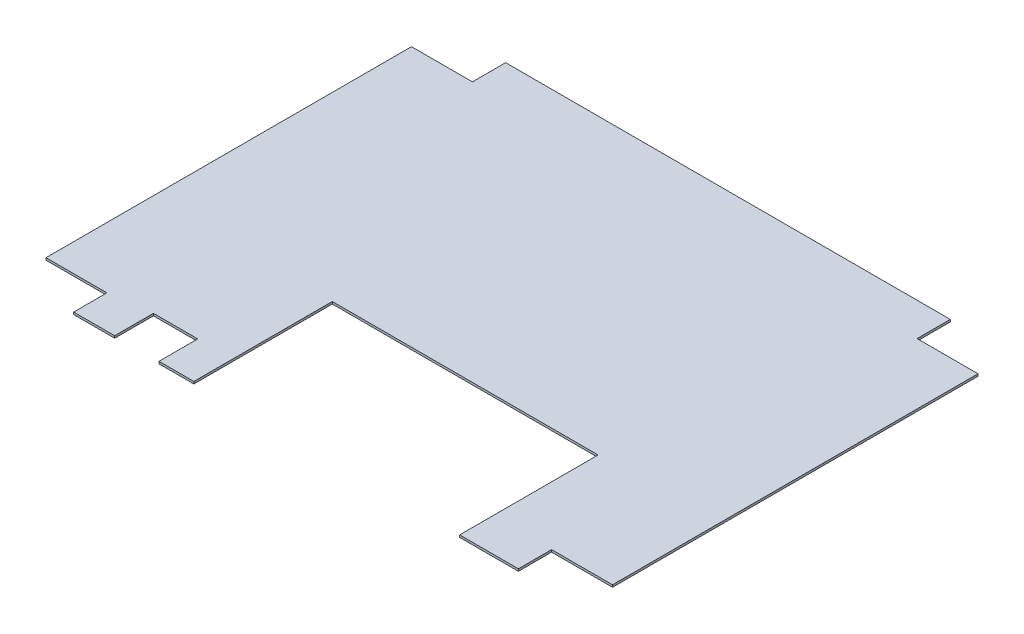
ISO-10303-21;
HEADER;
FILE_DESCRIPTION(('STEP AP214'),'2;1');
FILE_NAME('part.step','',(''),(''),'','','');
FILE_SCHEMA(('AUTOMOTIVE_DESIGN { 1 0 10303 214 1 1 1 1 }'));
ENDSEC;
DATA;
#1=APPLICATION_CONTEXT('core data for automotive mechanical design processes');
#2=APPLICATION_PROTOCOL_DEFINITION('international standard','automotive_design',2000,#1);
#3=PRODUCT_CONTEXT('',#1,'mechanical');
#4=PRODUCT('Part','Part','',(#3));
#5=PRODUCT_RELATED_PRODUCT_CATEGORY('part','',(#4));
#6=PRODUCT_DEFINITION_FORMATION('','',#4);
#7=PRODUCT_DEFINITION_CONTEXT('part definition',#1,'design');
#8=PRODUCT_DEFINITION('design','',#6,#7);
#9=PRODUCT_DEFINITION_SHAPE('','',#8);
#10=(LENGTH_UNIT() NAMED_UNIT(*) SI_UNIT(.MILLI.,.METRE.));
#11=(NAMED_UNIT(*) PLANE_ANGLE_UNIT() SI_UNIT($,.RADIAN.));
#12=(NAMED_UNIT(*) SI_UNIT($,.STERADIAN.) SOLID_ANGLE_UNIT());
#13=UNCERTAINTY_MEASURE_WITH_UNIT(LENGTH_MEASURE(1.E-05),#10,'distance_accuracy_value','');
#14=(GEOMETRIC_REPRESENTATION_CONTEXT(3) GLOBAL_UNCERTAINTY_ASSIGNED_CONTEXT((#13)) GLOBAL_UNIT_ASSIGNED_CONTEXT((#10,
#11,#12)) REPRESENTATION_CONTEXT('',''));
#15=CARTESIAN_POINT('',(0.,0.,0.));
#16=DIRECTION('',(0.,0.,1.));
#17=DIRECTION('',(1.,0.,0.));
#18=AXIS2_PLACEMENT_3D('',#15,#16,#17);
#19=CARTESIAN_POINT('',(0.,2.,0.));
#20=DIRECTION('',(0.,0.,-1.));
#21=DIRECTION('',(-1.,0.,0.));
#22=AXIS2_PLACEMENT_3D('',#19,#20,#21);
#23=PLANE('',#22);
#24=DIRECTION('',(1.,0.,0.));
#25=VECTOR('',#24,1.);
#26=CARTESIAN_POINT('',(0.,2.,0.));
#27=LINE('',#26,#25);
#28=CARTESIAN_POINT('',(132.,2.,0.));
#29=VERTEX_POINT('',#28);
#30=CARTESIAN_POINT('',(163.5,2.,0.));
#31=VERTEX_POINT('',#30);
#32=EDGE_CURVE('E224',#29,#31,#27,.T.);
#33=ORIENTED_EDGE('',*,*,#32,.F.);
#34=DIRECTION('',(0.,1.,0.));
#35=VECTOR('',#34,1.);
#36=CARTESIAN_POINT('',(132.,-53.1507290636733,0.));
#37=LINE('',#36,#35);
#38=CARTESIAN_POINT('',(132.,0.,0.));
#39=VERTEX_POINT('',#38);
#40=EDGE_CURVE('E212',#39,#29,#37,.T.);
#41=ORIENTED_EDGE('',*,*,#40,.F.);
#42=DIRECTION('',(1.,0.,0.));
#43=VECTOR('',#42,1.);
#44=CARTESIAN_POINT('',(0.,0.,0.));
#45=LINE('',#44,#43);
#46=CARTESIAN_POINT('',(163.5,0.,0.));
#47=VERTEX_POINT('',#46);
#48=EDGE_CURVE('E222',#39,#47,#45,.T.);
#49=ORIENTED_EDGE('',*,*,#48,.T.);
#50=DIRECTION('',(0.,1.,0.));
#51=VECTOR('',#50,1.);
#52=CARTESIAN_POINT('',(163.5,-270.601182554696,0.));
#53=LINE('',#52,#51);
#54=EDGE_CURVE('E405',#47,#31,#53,.T.);
#55=ORIENTED_EDGE('',*,*,#54,.T.);
#56=EDGE_LOOP('',(#33,#41,#49,#55));
#57=FACE_BOUND('',#56,.T.);
#58=ADVANCED_FACE('F38',(#57),#23,.F.);
#59=CARTESIAN_POINT('',(55.,0.,0.));
#60=VERTEX_POINT('',#59);
#61=CARTESIAN_POINT('',(92.,0.,0.));
#62=VERTEX_POINT('',#61);
#63=EDGE_CURVE('E231',#60,#62,#45,.T.);
#64=ORIENTED_EDGE('',*,*,#63,.T.);
#65=DIRECTION('',(0.,1.,0.));
#66=VECTOR('',#65,1.);
#67=CARTESIAN_POINT('',(92.,-53.1507290636733,0.));
#68=LINE('',#67,#66);
#69=CARTESIAN_POINT('',(92.,2.,0.));
#70=VERTEX_POINT('',#69);
#71=EDGE_CURVE('E56',#62,#70,#68,.T.);
#72=ORIENTED_EDGE('',*,*,#71,.T.);
#73=CARTESIAN_POINT('',(55.,2.,0.));
#74=VERTEX_POINT('',#73);
#75=EDGE_CURVE('E267',#74,#70,#27,.T.);
#76=ORIENTED_EDGE('',*,*,#75,.F.);
#77=DIRECTION('',(0.,1.,0.));
#78=VECTOR('',#77,1.);
#79=CARTESIAN_POINT('',(55.,-62.6498204307084,0.));
#80=LINE('',#79,#78);
#81=EDGE_CURVE('E308',#60,#74,#80,.T.);
#82=ORIENTED_EDGE('',*,*,#81,.F.);
#83=EDGE_LOOP('',(#64,#72,#76,#82));
#84=FACE_BOUND('',#83,.T.);
#85=ADVANCED_FACE('F446',(#84),#23,.F.);
#86=CARTESIAN_POINT('',(0.,2.,0.));
#87=DIRECTION('',(1.,0.,0.));
#88=DIRECTION('',(0.,0.,-1.));
#89=AXIS2_PLACEMENT_3D('',#86,#87,#88);
#90=PLANE('',#89);
#91=DIRECTION('',(0.,0.,1.));
#92=VECTOR('',#91,1.);
#93=CARTESIAN_POINT('',(0.,0.,0.));
#94=LINE('',#93,#92);
#95=CARTESIAN_POINT('',(0.,0.,-360.));
#96=VERTEX_POINT('',#95);
#97=CARTESIAN_POINT('',(0.,0.,-30.));
#98=VERTEX_POINT('',#97);
#99=EDGE_CURVE('E238',#96,#98,#94,.T.);
#100=ORIENTED_EDGE('',*,*,#99,.T.);
#101=DIRECTION('',(0.,1.,0.));
#102=VECTOR('',#101,1.);
#103=CARTESIAN_POINT('',(0.,-62.6498204307084,-30.));
#104=LINE('',#103,#102);
#105=CARTESIAN_POINT('',(0.,2.,-30.));
#106=VERTEX_POINT('',#105);
#107=EDGE_CURVE('E318',#98,#106,#104,.T.);
#108=ORIENTED_EDGE('',*,*,#107,.T.);
#109=DIRECTION('',(0.,0.,1.));
#110=VECTOR('',#109,1.);
#111=CARTESIAN_POINT('',(0.,2.,0.));
#112=LINE('',#111,#110);
#113=CARTESIAN_POINT('',(0.,2.,-360.));
#114=VERTEX_POINT('',#113);
#115=EDGE_CURVE('E250',#114,#106,#112,.T.);
#116=ORIENTED_EDGE('',*,*,#115,.F.);
#117=DIRECTION('',(0.,1.,0.));
#118=VECTOR('',#117,1.);
#119=CARTESIAN_POINT('',(0.,-62.6498204307084,-360.));
#120=LINE('',#119,#118);
#121=EDGE_CURVE('E313',#96,#114,#120,.T.);
#122=ORIENTED_EDGE('',*,*,#121,.F.);
#123=EDGE_LOOP('',(#100,#108,#116,#122));
#124=FACE_BOUND('',#123,.T.);
#125=ADVANCED_FACE('F40',(#124),#90,.F.);
#126=CARTESIAN_POINT('',(403.5,2.,0.));
#127=VERTEX_POINT('',#126);
#128=CARTESIAN_POINT('',(456.5,2.,0.));
#129=VERTEX_POINT('',#128);
#130=EDGE_CURVE('E258',#127,#129,#27,.T.);
#131=ORIENTED_EDGE('',*,*,#130,.F.);
#132=DIRECTION('',(0.,1.,0.));
#133=VECTOR('',#132,1.);
#134=CARTESIAN_POINT('',(403.5,-270.601182554696,0.));
#135=LINE('',#134,#133);
#136=CARTESIAN_POINT('',(403.5,0.,0.));
#137=VERTEX_POINT('',#136);
#138=EDGE_CURVE('E361',#137,#127,#135,.T.);
#139=ORIENTED_EDGE('',*,*,#138,.F.);
#140=CARTESIAN_POINT('',(456.5,0.,0.));
#141=VERTEX_POINT('',#140);
#142=EDGE_CURVE('E232',#137,#141,#45,.T.);
#143=ORIENTED_EDGE('',*,*,#142,.T.);
#144=DIRECTION('',(0.,1.,0.));
#145=VECTOR('',#144,1.);
#146=CARTESIAN_POINT('',(456.5,-62.6498204307084,0.));
#147=LINE('',#146,#145);
#148=EDGE_CURVE('E344',#141,#129,#147,.T.);
#149=ORIENTED_EDGE('',*,*,#148,.T.);
#150=EDGE_LOOP('',(#131,#139,#143,#149));
#151=FACE_BOUND('',#150,.T.);
#152=ADVANCED_FACE('F360',(#151),#23,.F.);
#153=CARTESIAN_POINT('',(511.5,2.,0.));
#154=DIRECTION('',(-1.,0.,0.));
#155=DIRECTION('',(0.,0.,1.));
#156=AXIS2_PLACEMENT_3D('',#153,#154,#155);
#157=PLANE('',#156);
#158=DIRECTION('',(0.,0.,-1.));
#159=VECTOR('',#158,1.);
#160=CARTESIAN_POINT('',(511.5,0.,0.));
#161=LINE('',#160,#159);
#162=CARTESIAN_POINT('',(511.5,0.,-30.));
#163=VERTEX_POINT('',#162);
#164=CARTESIAN_POINT('',(511.5,0.,-360.));
#165=VERTEX_POINT('',#164);
#166=EDGE_CURVE('E236',#163,#165,#161,.T.);
#167=ORIENTED_EDGE('',*,*,#166,.T.);
#168=DIRECTION('',(0.,1.,0.));
#169=VECTOR('',#168,1.);
#170=CARTESIAN_POINT('',(511.5,-62.6498204307084,-360.));
#171=LINE('',#170,#169);
#172=CARTESIAN_POINT('',(511.5,2.,-360.));
#173=VERTEX_POINT('',#172);
#174=EDGE_CURVE('E287',#165,#173,#171,.T.);
#175=ORIENTED_EDGE('',*,*,#174,.T.);
#176=DIRECTION('',(0.,0.,-1.));
#177=VECTOR('',#176,1.);
#178=CARTESIAN_POINT('',(511.5,2.,0.));
#179=LINE('',#178,#177);
#180=CARTESIAN_POINT('',(511.5,2.,-30.));
#181=VERTEX_POINT('',#180);
#182=EDGE_CURVE('E48',#181,#173,#179,.T.);
#183=ORIENTED_EDGE('',*,*,#182,.F.);
#184=DIRECTION('',(0.,1.,0.));
#185=VECTOR('',#184,1.);
#186=CARTESIAN_POINT('',(511.5,-62.6498204307084,-30.));
#187=LINE('',#186,#185);
#188=EDGE_CURVE('E269',#163,#181,#187,.T.);
#189=ORIENTED_EDGE('',*,*,#188,.F.);
#190=EDGE_LOOP('',(#167,#175,#183,#189));
#191=FACE_BOUND('',#190,.T.);
#192=ADVANCED_FACE('F286',(#191),#157,.F.);
#193=CARTESIAN_POINT('',(0.,2.,-390.));
#194=DIRECTION('',(0.,0.,1.));
#195=DIRECTION('',(1.,0.,0.));
#196=AXIS2_PLACEMENT_3D('',#193,#194,#195);
#197=PLANE('',#196);
#198=DIRECTION('',(-1.,0.,0.));
#199=VECTOR('',#198,1.);
#200=CARTESIAN_POINT('',(0.,2.,-390.));
#201=LINE('',#200,#199);
#202=CARTESIAN_POINT('',(456.5,2.,-390.));
#203=VERTEX_POINT('',#202);
#204=CARTESIAN_POINT('',(55.,2.,-390.));
#205=VERTEX_POINT('',#204);
#206=EDGE_CURVE('E11',#203,#205,#201,.T.);
#207=ORIENTED_EDGE('',*,*,#206,.F.);
#208=DIRECTION('',(0.,1.,0.));
#209=VECTOR('',#208,1.);
#210=CARTESIAN_POINT('',(456.5,-62.6498204307084,-390.));
#211=LINE('',#210,#209);
#212=CARTESIAN_POINT('',(456.5,0.,-390.));
#213=VERTEX_POINT('',#212);
#214=EDGE_CURVE('E302',#213,#203,#211,.T.);
#215=ORIENTED_EDGE('',*,*,#214,.F.);
#216=DIRECTION('',(-1.,0.,0.));
#217=VECTOR('',#216,1.);
#218=CARTESIAN_POINT('',(0.,0.,-390.));
#219=LINE('',#218,#217);
#220=CARTESIAN_POINT('',(55.,0.,-390.));
#221=VERTEX_POINT('',#220);
#222=EDGE_CURVE('E42',#213,#221,#219,.T.);
#223=ORIENTED_EDGE('',*,*,#222,.T.);
#224=DIRECTION('',(0.,1.,0.));
#225=VECTOR('',#224,1.);
#226=CARTESIAN_POINT('',(55.,-62.6498204307084,-390.));
#227=LINE('',#226,#225);
#228=EDGE_CURVE('E379',#221,#205,#227,.T.);
#229=ORIENTED_EDGE('',*,*,#228,.T.);
#230=EDGE_LOOP('',(#207,#215,#223,#229));
#231=FACE_BOUND('',#230,.T.);
#232=ADVANCED_FACE('F466',(#231),#197,.F.);
#233=CARTESIAN_POINT('',(0.,2.,0.));
#234=DIRECTION('',(0.,-1.,0.));
#235=DIRECTION('',(0.,0.,-1.));
#236=AXIS2_PLACEMENT_3D('',#233,#234,#235);
#237=PLANE('',#236);
#238=DIRECTION('',(-1.,0.,0.));
#239=VECTOR('',#238,1.);
#240=CARTESIAN_POINT('',(92.,2.,-35.));
#241=LINE('',#240,#239);
#242=CARTESIAN_POINT('',(132.,2.,-35.));
#243=VERTEX_POINT('',#242);
#244=CARTESIAN_POINT('',(92.,2.,-35.));
#245=VERTEX_POINT('',#244);
#246=EDGE_CURVE('E225',#243,#245,#241,.T.);
#247=ORIENTED_EDGE('',*,*,#246,.F.);
#248=DIRECTION('',(0.,0.,-1.));
#249=VECTOR('',#248,1.);
#250=CARTESIAN_POINT('',(132.,2.,0.));
#251=LINE('',#250,#249);
#252=EDGE_CURVE('E435',#29,#243,#251,.T.);
#253=ORIENTED_EDGE('',*,*,#252,.F.);
#254=ORIENTED_EDGE('',*,*,#32,.T.);
#255=DIRECTION('',(0.,0.,1.));
#256=VECTOR('',#255,1.);
#257=CARTESIAN_POINT('',(163.5,2.,0.));
#258=LINE('',#257,#256);
#259=CARTESIAN_POINT('',(163.5,2.,-125.));
#260=VERTEX_POINT('',#259);
#261=EDGE_CURVE('E415',#260,#31,#258,.T.);
#262=ORIENTED_EDGE('',*,*,#261,.F.);
#263=DIRECTION('',(-1.,0.,0.));
#264=VECTOR('',#263,1.);
#265=CARTESIAN_POINT('',(403.5,2.,-125.));
#266=LINE('',#265,#264);
#267=CARTESIAN_POINT('',(403.5,2.,-125.));
#268=VERTEX_POINT('',#267);
#269=EDGE_CURVE('E418',#268,#260,#266,.T.);
#270=ORIENTED_EDGE('',*,*,#269,.F.);
#271=DIRECTION('',(0.,0.,-1.));
#272=VECTOR('',#271,1.);
#273=CARTESIAN_POINT('',(403.5,2.,0.));
#274=LINE('',#273,#272);
#275=EDGE_CURVE('E357',#127,#268,#274,.T.);
#276=ORIENTED_EDGE('',*,*,#275,.F.);
#277=ORIENTED_EDGE('',*,*,#130,.T.);
#278=DIRECTION('',(0.,0.,1.));
#279=VECTOR('',#278,1.);
#280=CARTESIAN_POINT('',(456.5,2.,0.));
#281=LINE('',#280,#279);
#282=CARTESIAN_POINT('',(456.5,2.,-30.));
#283=VERTEX_POINT('',#282);
#284=EDGE_CURVE('E293',#283,#129,#281,.T.);
#285=ORIENTED_EDGE('',*,*,#284,.F.);
#286=DIRECTION('',(-1.,0.,0.));
#287=VECTOR('',#286,1.);
#288=CARTESIAN_POINT('',(511.5,2.,-30.));
#289=LINE('',#288,#287);
#290=EDGE_CURVE('E285',#181,#283,#289,.T.);
#291=ORIENTED_EDGE('',*,*,#290,.F.);
#292=ORIENTED_EDGE('',*,*,#182,.T.);
#293=DIRECTION('',(1.,0.,0.));
#294=VECTOR('',#293,1.);
#295=CARTESIAN_POINT('',(511.5,2.,-360.));
#296=LINE('',#295,#294);
#297=CARTESIAN_POINT('',(456.5,2.,-360.));
#298=VERTEX_POINT('',#297);
#299=EDGE_CURVE('E282',#298,#173,#296,.T.);
#300=ORIENTED_EDGE('',*,*,#299,.F.);
#301=DIRECTION('',(0.,0.,1.));
#302=VECTOR('',#301,1.);
#303=CARTESIAN_POINT('',(456.5,2.,-390.));
#304=LINE('',#303,#302);
#305=EDGE_CURVE('E327',#203,#298,#304,.T.);
#306=ORIENTED_EDGE('',*,*,#305,.F.);
#307=ORIENTED_EDGE('',*,*,#206,.T.);
#308=DIRECTION('',(0.,0.,-1.));
#309=VECTOR('',#308,1.);
#310=CARTESIAN_POINT('',(55.,2.,-390.));
#311=LINE('',#310,#309);
#312=CARTESIAN_POINT('',(55.,2.,-360.));
#313=VERTEX_POINT('',#312);
#314=EDGE_CURVE('E392',#313,#205,#311,.T.);
#315=ORIENTED_EDGE('',*,*,#314,.F.);
#316=DIRECTION('',(1.,0.,0.));
#317=VECTOR('',#316,1.);
#318=CARTESIAN_POINT('',(0.,2.,-360.));
#319=LINE('',#318,#317);
#320=EDGE_CURVE('E393',#114,#313,#319,.T.);
#321=ORIENTED_EDGE('',*,*,#320,.F.);
#322=ORIENTED_EDGE('',*,*,#115,.T.);
#323=DIRECTION('',(-1.,0.,0.));
#324=VECTOR('',#323,1.);
#325=CARTESIAN_POINT('',(0.,2.,-30.));
#326=LINE('',#325,#324);
#327=CARTESIAN_POINT('',(55.,2.,-30.));
#328=VERTEX_POINT('',#327);
#329=EDGE_CURVE('E305',#328,#106,#326,.T.);
#330=ORIENTED_EDGE('',*,*,#329,.F.);
#331=DIRECTION('',(0.,0.,-1.));
#332=VECTOR('',#331,1.);
#333=CARTESIAN_POINT('',(55.,2.,0.));
#334=LINE('',#333,#332);
#335=EDGE_CURVE('E309',#74,#328,#334,.T.);
#336=ORIENTED_EDGE('',*,*,#335,.F.);
#337=ORIENTED_EDGE('',*,*,#75,.T.);
#338=DIRECTION('',(0.,0.,1.));
#339=VECTOR('',#338,1.);
#340=CARTESIAN_POINT('',(92.,2.,0.));
#341=LINE('',#340,#339);
#342=EDGE_CURVE('E433',#245,#70,#341,.T.);
#343=ORIENTED_EDGE('',*,*,#342,.F.);
#344=EDGE_LOOP('',(#247,#253,#254,#262,#270,#276,#277,#285,#291,#292,#300,#306,#307,#315,#321,
#322,#330,#336,#337,#343));
#345=FACE_BOUND('',#344,.T.);
#346=ADVANCED_FACE('F280',(#345),#237,.F.);
#347=CARTESIAN_POINT('',(0.,0.,0.));
#348=DIRECTION('',(0.,-1.,0.));
#349=DIRECTION('',(0.,0.,-1.));
#350=AXIS2_PLACEMENT_3D('',#347,#348,#349);
#351=PLANE('',#350);
#352=DIRECTION('',(0.,0.,-1.));
#353=VECTOR('',#352,1.);
#354=CARTESIAN_POINT('',(132.,0.,0.));
#355=LINE('',#354,#353);
#356=CARTESIAN_POINT('',(132.,0.,-35.));
#357=VERTEX_POINT('',#356);
#358=EDGE_CURVE('E208',#39,#357,#355,.T.);
#359=ORIENTED_EDGE('',*,*,#358,.T.);
#360=DIRECTION('',(-1.,0.,0.));
#361=VECTOR('',#360,1.);
#362=CARTESIAN_POINT('',(92.,0.,-35.));
#363=LINE('',#362,#361);
#364=CARTESIAN_POINT('',(92.,0.,-35.));
#365=VERTEX_POINT('',#364);
#366=EDGE_CURVE('E428',#357,#365,#363,.T.);
#367=ORIENTED_EDGE('',*,*,#366,.T.);
#368=DIRECTION('',(0.,0.,1.));
#369=VECTOR('',#368,1.);
#370=CARTESIAN_POINT('',(92.,0.,0.));
#371=LINE('',#370,#369);
#372=EDGE_CURVE('E425',#365,#62,#371,.T.);
#373=ORIENTED_EDGE('',*,*,#372,.T.);
#374=ORIENTED_EDGE('',*,*,#63,.F.);
#375=DIRECTION('',(0.,0.,-1.));
#376=VECTOR('',#375,1.);
#377=CARTESIAN_POINT('',(55.,0.,0.));
#378=LINE('',#377,#376);
#379=CARTESIAN_POINT('',(55.,0.,-30.));
#380=VERTEX_POINT('',#379);
#381=EDGE_CURVE('E320',#60,#380,#378,.T.);
#382=ORIENTED_EDGE('',*,*,#381,.T.);
#383=DIRECTION('',(-1.,0.,0.));
#384=VECTOR('',#383,1.);
#385=CARTESIAN_POINT('',(0.,0.,-30.));
#386=LINE('',#385,#384);
#387=EDGE_CURVE('E314',#380,#98,#386,.T.);
#388=ORIENTED_EDGE('',*,*,#387,.T.);
#389=ORIENTED_EDGE('',*,*,#99,.F.);
#390=DIRECTION('',(1.,0.,0.));
#391=VECTOR('',#390,1.);
#392=CARTESIAN_POINT('',(0.,0.,-360.));
#393=LINE('',#392,#391);
#394=CARTESIAN_POINT('',(55.,0.,-360.));
#395=VERTEX_POINT('',#394);
#396=EDGE_CURVE('E383',#96,#395,#393,.T.);
#397=ORIENTED_EDGE('',*,*,#396,.T.);
#398=DIRECTION('',(0.,0.,-1.));
#399=VECTOR('',#398,1.);
#400=CARTESIAN_POINT('',(55.,0.,-390.));
#401=LINE('',#400,#399);
#402=EDGE_CURVE('E382',#395,#221,#401,.T.);
#403=ORIENTED_EDGE('',*,*,#402,.T.);
#404=ORIENTED_EDGE('',*,*,#222,.F.);
#405=DIRECTION('',(0.,0.,1.));
#406=VECTOR('',#405,1.);
#407=CARTESIAN_POINT('',(456.5,0.,-390.));
#408=LINE('',#407,#406);
#409=CARTESIAN_POINT('',(456.5,0.,-360.));
#410=VERTEX_POINT('',#409);
#411=EDGE_CURVE('E299',#213,#410,#408,.T.);
#412=ORIENTED_EDGE('',*,*,#411,.T.);
#413=DIRECTION('',(1.,0.,0.));
#414=VECTOR('',#413,1.);
#415=CARTESIAN_POINT('',(511.5,0.,-360.));
#416=LINE('',#415,#414);
#417=EDGE_CURVE('E290',#410,#165,#416,.T.);
#418=ORIENTED_EDGE('',*,*,#417,.T.);
#419=ORIENTED_EDGE('',*,*,#166,.F.);
#420=DIRECTION('',(-1.,0.,0.));
#421=VECTOR('',#420,1.);
#422=CARTESIAN_POINT('',(511.5,0.,-30.));
#423=LINE('',#422,#421);
#424=CARTESIAN_POINT('',(456.5,0.,-30.));
#425=VERTEX_POINT('',#424);
#426=EDGE_CURVE('E334',#163,#425,#423,.T.);
#427=ORIENTED_EDGE('',*,*,#426,.T.);
#428=DIRECTION('',(0.,0.,1.));
#429=VECTOR('',#428,1.);
#430=CARTESIAN_POINT('',(456.5,0.,0.));
#431=LINE('',#430,#429);
#432=EDGE_CURVE('E340',#425,#141,#431,.T.);
#433=ORIENTED_EDGE('',*,*,#432,.T.);
#434=ORIENTED_EDGE('',*,*,#142,.F.);
#435=DIRECTION('',(0.,0.,-1.));
#436=VECTOR('',#435,1.);
#437=CARTESIAN_POINT('',(403.5,0.,0.));
#438=LINE('',#437,#436);
#439=CARTESIAN_POINT('',(403.5,0.,-125.));
#440=VERTEX_POINT('',#439);
#441=EDGE_CURVE('E400',#137,#440,#438,.T.);
#442=ORIENTED_EDGE('',*,*,#441,.T.);
#443=DIRECTION('',(-1.,0.,0.));
#444=VECTOR('',#443,1.);
#445=CARTESIAN_POINT('',(403.5,0.,-125.));
#446=LINE('',#445,#444);
#447=CARTESIAN_POINT('',(163.5,0.,-125.));
#448=VERTEX_POINT('',#447);
#449=EDGE_CURVE('E404',#440,#448,#446,.T.);
#450=ORIENTED_EDGE('',*,*,#449,.T.);
#451=DIRECTION('',(0.,0.,1.));
#452=VECTOR('',#451,1.);
#453=CARTESIAN_POINT('',(163.5,0.,0.));
#454=LINE('',#453,#452);
#455=EDGE_CURVE('E230',#448,#47,#454,.T.);
#456=ORIENTED_EDGE('',*,*,#455,.T.);
#457=ORIENTED_EDGE('',*,*,#48,.F.);
#458=EDGE_LOOP('',(#359,#367,#373,#374,#382,#388,#389,#397,#403,#404,#412,#418,#419,#427,#433,
#434,#442,#450,#456,#457));
#459=FACE_BOUND('',#458,.T.);
#460=ADVANCED_FACE('F228',(#459),#351,.T.);
#461=CARTESIAN_POINT('',(511.5,-62.6498204307084,-30.));
#462=DIRECTION('',(0.,0.,-1.));
#463=DIRECTION('',(-1.,0.,0.));
#464=AXIS2_PLACEMENT_3D('',#461,#462,#463);
#465=PLANE('',#464);
#466=ORIENTED_EDGE('',*,*,#188,.T.);
#467=ORIENTED_EDGE('',*,*,#290,.T.);
#468=DIRECTION('',(0.,1.,0.));
#469=VECTOR('',#468,1.);
#470=CARTESIAN_POINT('',(456.5,-62.6498204307084,-30.));
#471=LINE('',#470,#469);
#472=EDGE_CURVE('E339',#425,#283,#471,.T.);
#473=ORIENTED_EDGE('',*,*,#472,.F.);
#474=ORIENTED_EDGE('',*,*,#426,.F.);
#475=EDGE_LOOP('',(#466,#467,#473,#474));
#476=FACE_BOUND('',#475,.T.);
#477=ADVANCED_FACE('F353',(#476),#465,.F.);
#478=CARTESIAN_POINT('',(456.5,-62.6498204307084,0.));
#479=DIRECTION('',(-1.,0.,0.));
#480=DIRECTION('',(0.,0.,1.));
#481=AXIS2_PLACEMENT_3D('',#478,#479,#480);
#482=PLANE('',#481);
#483=ORIENTED_EDGE('',*,*,#472,.T.);
#484=ORIENTED_EDGE('',*,*,#284,.T.);
#485=ORIENTED_EDGE('',*,*,#148,.F.);
#486=ORIENTED_EDGE('',*,*,#432,.F.);
#487=EDGE_LOOP('',(#483,#484,#485,#486));
#488=FACE_BOUND('',#487,.T.);
#489=ADVANCED_FACE('F350',(#488),#482,.F.);
#490=CARTESIAN_POINT('',(0.,-62.6498204307084,-360.));
#491=DIRECTION('',(0.,0.,1.));
#492=DIRECTION('',(1.,0.,0.));
#493=AXIS2_PLACEMENT_3D('',#490,#491,#492);
#494=PLANE('',#493);
#495=ORIENTED_EDGE('',*,*,#121,.T.);
#496=ORIENTED_EDGE('',*,*,#320,.T.);
#497=DIRECTION('',(0.,1.,0.));
#498=VECTOR('',#497,1.);
#499=CARTESIAN_POINT('',(55.,-62.6498204307084,-360.));
#500=LINE('',#499,#498);
#501=EDGE_CURVE('E380',#395,#313,#500,.T.);
#502=ORIENTED_EDGE('',*,*,#501,.F.);
#503=ORIENTED_EDGE('',*,*,#396,.F.);
#504=EDGE_LOOP('',(#495,#496,#502,#503));
#505=FACE_BOUND('',#504,.T.);
#506=ADVANCED_FACE('F462',(#505),#494,.F.);
#507=CARTESIAN_POINT('',(55.,-62.6498204307084,-390.));
#508=DIRECTION('',(1.,0.,0.));
#509=DIRECTION('',(0.,0.,-1.));
#510=AXIS2_PLACEMENT_3D('',#507,#508,#509);
#511=PLANE('',#510);
#512=ORIENTED_EDGE('',*,*,#501,.T.);
#513=ORIENTED_EDGE('',*,*,#314,.T.);
#514=ORIENTED_EDGE('',*,*,#228,.F.);
#515=ORIENTED_EDGE('',*,*,#402,.F.);
#516=EDGE_LOOP('',(#512,#513,#514,#515));
#517=FACE_BOUND('',#516,.T.);
#518=ADVANCED_FACE('F465',(#517),#511,.F.);
#519=CARTESIAN_POINT('',(55.,-62.6498204307084,0.));
#520=DIRECTION('',(1.,0.,0.));
#521=DIRECTION('',(0.,0.,-1.));
#522=AXIS2_PLACEMENT_3D('',#519,#520,#521);
#523=PLANE('',#522);
#524=ORIENTED_EDGE('',*,*,#81,.T.);
#525=ORIENTED_EDGE('',*,*,#335,.T.);
#526=DIRECTION('',(0.,1.,0.));
#527=VECTOR('',#526,1.);
#528=CARTESIAN_POINT('',(55.,-62.6498204307084,-30.));
#529=LINE('',#528,#527);
#530=EDGE_CURVE('E319',#380,#328,#529,.T.);
#531=ORIENTED_EDGE('',*,*,#530,.F.);
#532=ORIENTED_EDGE('',*,*,#381,.F.);
#533=EDGE_LOOP('',(#524,#525,#531,#532));
#534=FACE_BOUND('',#533,.T.);
#535=ADVANCED_FACE('F453',(#534),#523,.F.);
#536=CARTESIAN_POINT('',(0.,-62.6498204307084,-30.));
#537=DIRECTION('',(0.,0.,-1.));
#538=DIRECTION('',(-1.,0.,0.));
#539=AXIS2_PLACEMENT_3D('',#536,#537,#538);
#540=PLANE('',#539);
#541=ORIENTED_EDGE('',*,*,#530,.T.);
#542=ORIENTED_EDGE('',*,*,#329,.T.);
#543=ORIENTED_EDGE('',*,*,#107,.F.);
#544=ORIENTED_EDGE('',*,*,#387,.F.);
#545=EDGE_LOOP('',(#541,#542,#543,#544));
#546=FACE_BOUND('',#545,.T.);
#547=ADVANCED_FACE('F455',(#546),#540,.F.);
#548=CARTESIAN_POINT('',(456.5,-62.6498204307084,-390.));
#549=DIRECTION('',(-1.,0.,0.));
#550=DIRECTION('',(0.,0.,1.));
#551=AXIS2_PLACEMENT_3D('',#548,#549,#550);
#552=PLANE('',#551);
#553=ORIENTED_EDGE('',*,*,#214,.T.);
#554=ORIENTED_EDGE('',*,*,#305,.T.);
#555=DIRECTION('',(0.,1.,0.));
#556=VECTOR('',#555,1.);
#557=CARTESIAN_POINT('',(456.5,-62.6498204307084,-360.));
#558=LINE('',#557,#556);
#559=EDGE_CURVE('E295',#410,#298,#558,.T.);
#560=ORIENTED_EDGE('',*,*,#559,.F.);
#561=ORIENTED_EDGE('',*,*,#411,.F.);
#562=EDGE_LOOP('',(#553,#554,#560,#561));
#563=FACE_BOUND('',#562,.T.);
#564=ADVANCED_FACE('F369',(#563),#552,.F.);
#565=CARTESIAN_POINT('',(511.5,-62.6498204307084,-360.));
#566=DIRECTION('',(0.,0.,1.));
#567=DIRECTION('',(1.,0.,0.));
#568=AXIS2_PLACEMENT_3D('',#565,#566,#567);
#569=PLANE('',#568);
#570=ORIENTED_EDGE('',*,*,#559,.T.);
#571=ORIENTED_EDGE('',*,*,#299,.T.);
#572=ORIENTED_EDGE('',*,*,#174,.F.);
#573=ORIENTED_EDGE('',*,*,#417,.F.);
#574=EDGE_LOOP('',(#570,#571,#572,#573));
#575=FACE_BOUND('',#574,.T.);
#576=ADVANCED_FACE('F366',(#575),#569,.F.);
#577=CARTESIAN_POINT('',(403.5,-270.601182554696,-125.));
#578=DIRECTION('',(0.,0.,-1.));
#579=DIRECTION('',(-1.,0.,0.));
#580=AXIS2_PLACEMENT_3D('',#577,#578,#579);
#581=PLANE('',#580);
#582=DIRECTION('',(0.,1.,0.));
#583=VECTOR('',#582,1.);
#584=CARTESIAN_POINT('',(403.5,-270.601182554696,-125.));
#585=LINE('',#584,#583);
#586=EDGE_CURVE('E67',#440,#268,#585,.T.);
#587=ORIENTED_EDGE('',*,*,#586,.T.);
#588=ORIENTED_EDGE('',*,*,#269,.T.);
#589=DIRECTION('',(0.,1.,0.));
#590=VECTOR('',#589,1.);
#591=CARTESIAN_POINT('',(163.5,-270.601182554696,-125.));
#592=LINE('',#591,#590);
#593=EDGE_CURVE('E401',#448,#260,#592,.T.);
#594=ORIENTED_EDGE('',*,*,#593,.F.);
#595=ORIENTED_EDGE('',*,*,#449,.F.);
#596=EDGE_LOOP('',(#587,#588,#594,#595));
#597=FACE_BOUND('',#596,.T.);
#598=ADVANCED_FACE('F546',(#597),#581,.F.);
#599=CARTESIAN_POINT('',(163.5,-270.601182554696,0.));
#600=DIRECTION('',(-1.,0.,0.));
#601=DIRECTION('',(0.,0.,1.));
#602=AXIS2_PLACEMENT_3D('',#599,#600,#601);
#603=PLANE('',#602);
#604=ORIENTED_EDGE('',*,*,#593,.T.);
#605=ORIENTED_EDGE('',*,*,#261,.T.);
#606=ORIENTED_EDGE('',*,*,#54,.F.);
#607=ORIENTED_EDGE('',*,*,#455,.F.);
#608=EDGE_LOOP('',(#604,#605,#606,#607));
#609=FACE_BOUND('',#608,.T.);
#610=ADVANCED_FACE('F543',(#609),#603,.F.);
#611=CARTESIAN_POINT('',(403.5,-270.601182554696,0.));
#612=DIRECTION('',(1.,0.,0.));
#613=DIRECTION('',(0.,0.,-1.));
#614=AXIS2_PLACEMENT_3D('',#611,#612,#613);
#615=PLANE('',#614);
#616=ORIENTED_EDGE('',*,*,#138,.T.);
#617=ORIENTED_EDGE('',*,*,#275,.T.);
#618=ORIENTED_EDGE('',*,*,#586,.F.);
#619=ORIENTED_EDGE('',*,*,#441,.F.);
#620=EDGE_LOOP('',(#616,#617,#618,#619));
#621=FACE_BOUND('',#620,.T.);
#622=ADVANCED_FACE('F520',(#621),#615,.F.);
#623=CARTESIAN_POINT('',(132.,-53.1507290636733,0.));
#624=DIRECTION('',(1.,0.,0.));
#625=DIRECTION('',(0.,0.,-1.));
#626=AXIS2_PLACEMENT_3D('',#623,#624,#625);
#627=PLANE('',#626);
#628=ORIENTED_EDGE('',*,*,#40,.T.);
#629=ORIENTED_EDGE('',*,*,#252,.T.);
#630=DIRECTION('',(0.,1.,0.));
#631=VECTOR('',#630,1.);
#632=CARTESIAN_POINT('',(132.,-53.1507290636733,-35.));
#633=LINE('',#632,#631);
#634=EDGE_CURVE('E214',#357,#243,#633,.T.);
#635=ORIENTED_EDGE('',*,*,#634,.F.);
#636=ORIENTED_EDGE('',*,*,#358,.F.);
#637=EDGE_LOOP('',(#628,#629,#635,#636));
#638=FACE_BOUND('',#637,.T.);
#639=ADVANCED_FACE('F210',(#638),#627,.F.);
#640=CARTESIAN_POINT('',(92.,-53.1507290636733,-35.));
#641=DIRECTION('',(0.,0.,-1.));
#642=DIRECTION('',(-1.,0.,0.));
#643=AXIS2_PLACEMENT_3D('',#640,#641,#642);
#644=PLANE('',#643);
#645=ORIENTED_EDGE('',*,*,#634,.T.);
#646=ORIENTED_EDGE('',*,*,#246,.T.);
#647=DIRECTION('',(0.,1.,0.));
#648=VECTOR('',#647,1.);
#649=CARTESIAN_POINT('',(92.,-53.1507290636733,-35.));
#650=LINE('',#649,#648);
#651=EDGE_CURVE('E429',#365,#245,#650,.T.);
#652=ORIENTED_EDGE('',*,*,#651,.F.);
#653=ORIENTED_EDGE('',*,*,#366,.F.);
#654=EDGE_LOOP('',(#645,#646,#652,#653));
#655=FACE_BOUND('',#654,.T.);
#656=ADVANCED_FACE('F441',(#655),#644,.F.);
#657=CARTESIAN_POINT('',(92.,-53.1507290636733,0.));
#658=DIRECTION('',(-1.,0.,0.));
#659=DIRECTION('',(0.,0.,1.));
#660=AXIS2_PLACEMENT_3D('',#657,#658,#659);
#661=PLANE('',#660);
#662=ORIENTED_EDGE('',*,*,#651,.T.);
#663=ORIENTED_EDGE('',*,*,#342,.T.);
#664=ORIENTED_EDGE('',*,*,#71,.F.);
#665=ORIENTED_EDGE('',*,*,#372,.F.);
#666=EDGE_LOOP('',(#662,#663,#664,#665));
#667=FACE_BOUND('',#666,.T.);
#668=ADVANCED_FACE('F444',(#667),#661,.F.);
#669=CLOSED_SHELL('',(#58,#85,#125,#152,#192,#232,#346,#460,#477,#489,#506,#518,#535,#547,#564,
#576,#598,#610,#622,#639,#656,#668));
#670=MANIFOLD_SOLID_BREP('B2',#669);
#671=ADVANCED_BREP_SHAPE_REPRESENTATION('',(#18,#670),#14);
#672=SHAPE_DEFINITION_REPRESENTATION(#9,#671);
ENDSEC;
END-ISO-10303-21;
